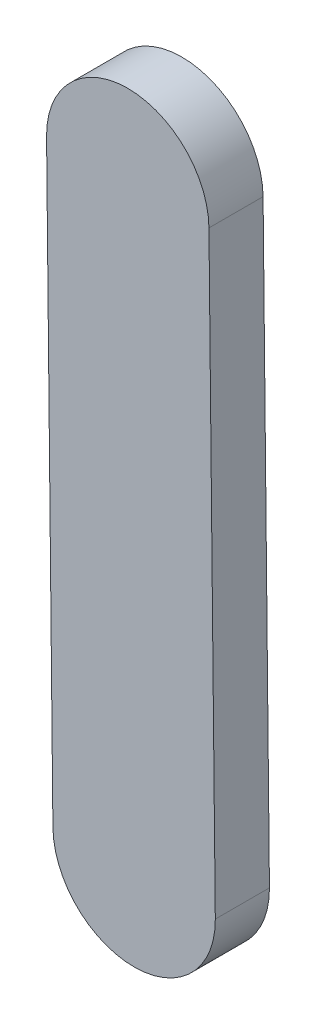
ISO-10303-21;
HEADER;
FILE_DESCRIPTION(('STEP AP214'),'2;1');
FILE_NAME('part.step','',(''),(''),'','','');
FILE_SCHEMA(('AUTOMOTIVE_DESIGN { 1 0 10303 214 1 1 1 1 }'));
ENDSEC;
DATA;
#1=APPLICATION_CONTEXT('core data for automotive mechanical design processes');
#2=APPLICATION_PROTOCOL_DEFINITION('international standard','automotive_design',2000,#1);
#3=PRODUCT_CONTEXT('',#1,'mechanical');
#4=PRODUCT('Part','Part','',(#3));
#5=PRODUCT_RELATED_PRODUCT_CATEGORY('part','',(#4));
#6=PRODUCT_DEFINITION_FORMATION('','',#4);
#7=PRODUCT_DEFINITION_CONTEXT('part definition',#1,'design');
#8=PRODUCT_DEFINITION('design','',#6,#7);
#9=PRODUCT_DEFINITION_SHAPE('','',#8);
#10=(LENGTH_UNIT() NAMED_UNIT(*) SI_UNIT(.MILLI.,.METRE.));
#11=(NAMED_UNIT(*) PLANE_ANGLE_UNIT() SI_UNIT($,.RADIAN.));
#12=(NAMED_UNIT(*) SI_UNIT($,.STERADIAN.) SOLID_ANGLE_UNIT());
#13=UNCERTAINTY_MEASURE_WITH_UNIT(LENGTH_MEASURE(1.E-05),#10,'distance_accuracy_value','');
#14=(GEOMETRIC_REPRESENTATION_CONTEXT(3) GLOBAL_UNCERTAINTY_ASSIGNED_CONTEXT((#13)) GLOBAL_UNIT_ASSIGNED_CONTEXT((#10,
#11,#12)) REPRESENTATION_CONTEXT('',''));
#15=CARTESIAN_POINT('',(0.,0.,0.));
#16=DIRECTION('',(0.,0.,1.));
#17=DIRECTION('',(1.,0.,0.));
#18=AXIS2_PLACEMENT_3D('',#15,#16,#17);
#19=CARTESIAN_POINT('',(-48.5795121077504,77.5746135752036,1.));
#20=DIRECTION('',(0.,0.,-1.));
#21=DIRECTION('',(-1.,0.,0.));
#22=AXIS2_PLACEMENT_3D('',#19,#20,#21);
#23=CYLINDRICAL_SURFACE('',#22,1.5);
#24=CARTESIAN_POINT('',(-48.5795121077504,77.5746135752036,0.));
#25=DIRECTION('',(0.,0.,1.));
#26=DIRECTION('',(1.,0.,0.));
#27=AXIS2_PLACEMENT_3D('',#24,#25,#26);
#28=CIRCLE('',#27,1.5);
#29=CARTESIAN_POINT('',(-47.079597585683,77.5906268975032,0.));
#30=VERTEX_POINT('',#29);
#31=CARTESIAN_POINT('',(-50.0794266298179,77.5586002529039,0.));
#32=VERTEX_POINT('',#31);
#33=EDGE_CURVE('E102',#30,#32,#28,.T.);
#34=ORIENTED_EDGE('',*,*,#33,.T.);
#35=DIRECTION('',(0.,0.,-1.));
#36=VECTOR('',#35,1.);
#37=CARTESIAN_POINT('',(-50.0794266298179,77.5586002529039,1.));
#38=LINE('',#37,#36);
#39=CARTESIAN_POINT('',(-50.0794266298179,77.5586002529039,1.));
#40=VERTEX_POINT('',#39);
#41=EDGE_CURVE('E11',#40,#32,#38,.T.);
#42=ORIENTED_EDGE('',*,*,#41,.F.);
#43=CARTESIAN_POINT('',(-48.5795121077504,77.5746135752036,1.));
#44=DIRECTION('',(0.,0.,1.));
#45=DIRECTION('',(1.,0.,0.));
#46=AXIS2_PLACEMENT_3D('',#43,#44,#45);
#47=CIRCLE('',#46,1.5);
#48=CARTESIAN_POINT('',(-47.079597585683,77.5906268975032,1.));
#49=VERTEX_POINT('',#48);
#50=EDGE_CURVE('E90',#49,#40,#47,.T.);
#51=ORIENTED_EDGE('',*,*,#50,.F.);
#52=DIRECTION('',(0.,0.,-1.));
#53=VECTOR('',#52,1.);
#54=CARTESIAN_POINT('',(-47.079597585683,77.5906268975032,1.));
#55=LINE('',#54,#53);
#56=EDGE_CURVE('E98',#49,#30,#55,.T.);
#57=ORIENTED_EDGE('',*,*,#56,.T.);
#58=EDGE_LOOP('',(#34,#42,#51,#57));
#59=FACE_BOUND('',#58,.T.);
#60=ADVANCED_FACE('F39',(#59),#23,.T.);
#61=CARTESIAN_POINT('',(-50.0794266298179,77.5586002529039,1.));
#62=DIRECTION('',(0.999943014711656,0.0106755481997694,0.));
#63=DIRECTION('',(-0.0106755481997694,0.999943014711656,0.));
#64=AXIS2_PLACEMENT_3D('',#61,#62,#63);
#65=PLANE('',#64);
#66=DIRECTION('',(0.0106755481997694,-0.999943014711656,0.));
#67=VECTOR('',#66,1.);
#68=CARTESIAN_POINT('',(-50.0794266298179,77.5586002529039,0.));
#69=LINE('',#68,#67);
#70=CARTESIAN_POINT('',(-49.9619955996205,66.5592270910757,0.));
#71=VERTEX_POINT('',#70);
#72=EDGE_CURVE('E94',#32,#71,#69,.T.);
#73=ORIENTED_EDGE('',*,*,#72,.T.);
#74=DIRECTION('',(0.,0.,-1.));
#75=VECTOR('',#74,1.);
#76=CARTESIAN_POINT('',(-49.9619955996205,66.5592270910757,1.));
#77=LINE('',#76,#75);
#78=CARTESIAN_POINT('',(-49.9619955996205,66.5592270910757,1.));
#79=VERTEX_POINT('',#78);
#80=EDGE_CURVE('E47',#79,#71,#77,.T.);
#81=ORIENTED_EDGE('',*,*,#80,.F.);
#82=DIRECTION('',(0.0106755481997694,-0.999943014711656,0.));
#83=VECTOR('',#82,1.);
#84=CARTESIAN_POINT('',(-50.0794266298179,77.5586002529039,1.));
#85=LINE('',#84,#83);
#86=EDGE_CURVE('E85',#40,#79,#85,.T.);
#87=ORIENTED_EDGE('',*,*,#86,.F.);
#88=ORIENTED_EDGE('',*,*,#41,.T.);
#89=EDGE_LOOP('',(#73,#81,#87,#88));
#90=FACE_BOUND('',#89,.T.);
#91=ADVANCED_FACE('F93',(#90),#65,.F.);
#92=CARTESIAN_POINT('',(-48.462081077553,66.5752404133754,1.));
#93=DIRECTION('',(0.,0.,-1.));
#94=DIRECTION('',(-1.,0.,0.));
#95=AXIS2_PLACEMENT_3D('',#92,#93,#94);
#96=CYLINDRICAL_SURFACE('',#95,1.49999999999999);
#97=CARTESIAN_POINT('',(-48.462081077553,66.5752404133754,0.));
#98=DIRECTION('',(0.,0.,1.));
#99=DIRECTION('',(1.,0.,0.));
#100=AXIS2_PLACEMENT_3D('',#97,#98,#99);
#101=CIRCLE('',#100,1.49999999999999);
#102=CARTESIAN_POINT('',(-46.9621665554855,66.591253735675,0.));
#103=VERTEX_POINT('',#102);
#104=EDGE_CURVE('E72',#71,#103,#101,.T.);
#105=ORIENTED_EDGE('',*,*,#104,.T.);
#106=DIRECTION('',(0.,0.,-1.));
#107=VECTOR('',#106,1.);
#108=CARTESIAN_POINT('',(-46.9621665554855,66.591253735675,1.));
#109=LINE('',#108,#107);
#110=CARTESIAN_POINT('',(-46.9621665554855,66.591253735675,1.));
#111=VERTEX_POINT('',#110);
#112=EDGE_CURVE('E95',#111,#103,#109,.T.);
#113=ORIENTED_EDGE('',*,*,#112,.F.);
#114=CARTESIAN_POINT('',(-48.462081077553,66.5752404133754,1.));
#115=DIRECTION('',(0.,0.,1.));
#116=DIRECTION('',(1.,0.,0.));
#117=AXIS2_PLACEMENT_3D('',#114,#115,#116);
#118=CIRCLE('',#117,1.49999999999999);
#119=EDGE_CURVE('E88',#79,#111,#118,.T.);
#120=ORIENTED_EDGE('',*,*,#119,.F.);
#121=ORIENTED_EDGE('',*,*,#80,.T.);
#122=EDGE_LOOP('',(#105,#113,#120,#121));
#123=FACE_BOUND('',#122,.T.);
#124=ADVANCED_FACE('F96',(#123),#96,.T.);
#125=CARTESIAN_POINT('',(-47.079597585683,77.5906268975032,1.));
#126=DIRECTION('',(-0.999943014711656,-0.0106755481997675,0.));
#127=DIRECTION('',(0.0106755481997675,-0.999943014711656,0.));
#128=AXIS2_PLACEMENT_3D('',#125,#126,#127);
#129=PLANE('',#128);
#130=DIRECTION('',(-0.0106755481997675,0.999943014711656,0.));
#131=VECTOR('',#130,1.);
#132=CARTESIAN_POINT('',(-47.079597585683,77.5906268975032,0.));
#133=LINE('',#132,#131);
#134=EDGE_CURVE('E78',#103,#30,#133,.T.);
#135=ORIENTED_EDGE('',*,*,#134,.T.);
#136=ORIENTED_EDGE('',*,*,#56,.F.);
#137=DIRECTION('',(-0.0106755481997675,0.999943014711656,0.));
#138=VECTOR('',#137,1.);
#139=CARTESIAN_POINT('',(-47.079597585683,77.5906268975032,1.));
#140=LINE('',#139,#138);
#141=EDGE_CURVE('E55',#111,#49,#140,.T.);
#142=ORIENTED_EDGE('',*,*,#141,.F.);
#143=ORIENTED_EDGE('',*,*,#112,.T.);
#144=EDGE_LOOP('',(#135,#136,#142,#143));
#145=FACE_BOUND('',#144,.T.);
#146=ADVANCED_FACE('F109',(#145),#129,.F.);
#147=CARTESIAN_POINT('',(-48.5795121077504,77.5746135752036,1.));
#148=DIRECTION('',(0.,0.,1.));
#149=DIRECTION('',(1.,0.,0.));
#150=AXIS2_PLACEMENT_3D('',#147,#148,#149);
#151=PLANE('',#150);
#152=ORIENTED_EDGE('',*,*,#50,.T.);
#153=ORIENTED_EDGE('',*,*,#86,.T.);
#154=ORIENTED_EDGE('',*,*,#119,.T.);
#155=ORIENTED_EDGE('',*,*,#141,.T.);
#156=EDGE_LOOP('',(#152,#153,#154,#155));
#157=FACE_BOUND('',#156,.T.);
#158=ADVANCED_FACE('F86',(#157),#151,.T.);
#159=CARTESIAN_POINT('',(-48.5795121077504,77.5746135752036,0.));
#160=DIRECTION('',(0.,0.,1.));
#161=DIRECTION('',(1.,0.,0.));
#162=AXIS2_PLACEMENT_3D('',#159,#160,#161);
#163=PLANE('',#162);
#164=ORIENTED_EDGE('',*,*,#33,.F.);
#165=ORIENTED_EDGE('',*,*,#134,.F.);
#166=ORIENTED_EDGE('',*,*,#104,.F.);
#167=ORIENTED_EDGE('',*,*,#72,.F.);
#168=EDGE_LOOP('',(#164,#165,#166,#167));
#169=FACE_BOUND('',#168,.T.);
#170=ADVANCED_FACE('F112',(#169),#163,.F.);
#171=CLOSED_SHELL('',(#60,#91,#124,#146,#158,#170));
#172=MANIFOLD_SOLID_BREP('B2',#171);
#173=ADVANCED_BREP_SHAPE_REPRESENTATION('',(#18,#172),#14);
#174=SHAPE_DEFINITION_REPRESENTATION(#9,#173);
ENDSEC;
END-ISO-10303-21;
